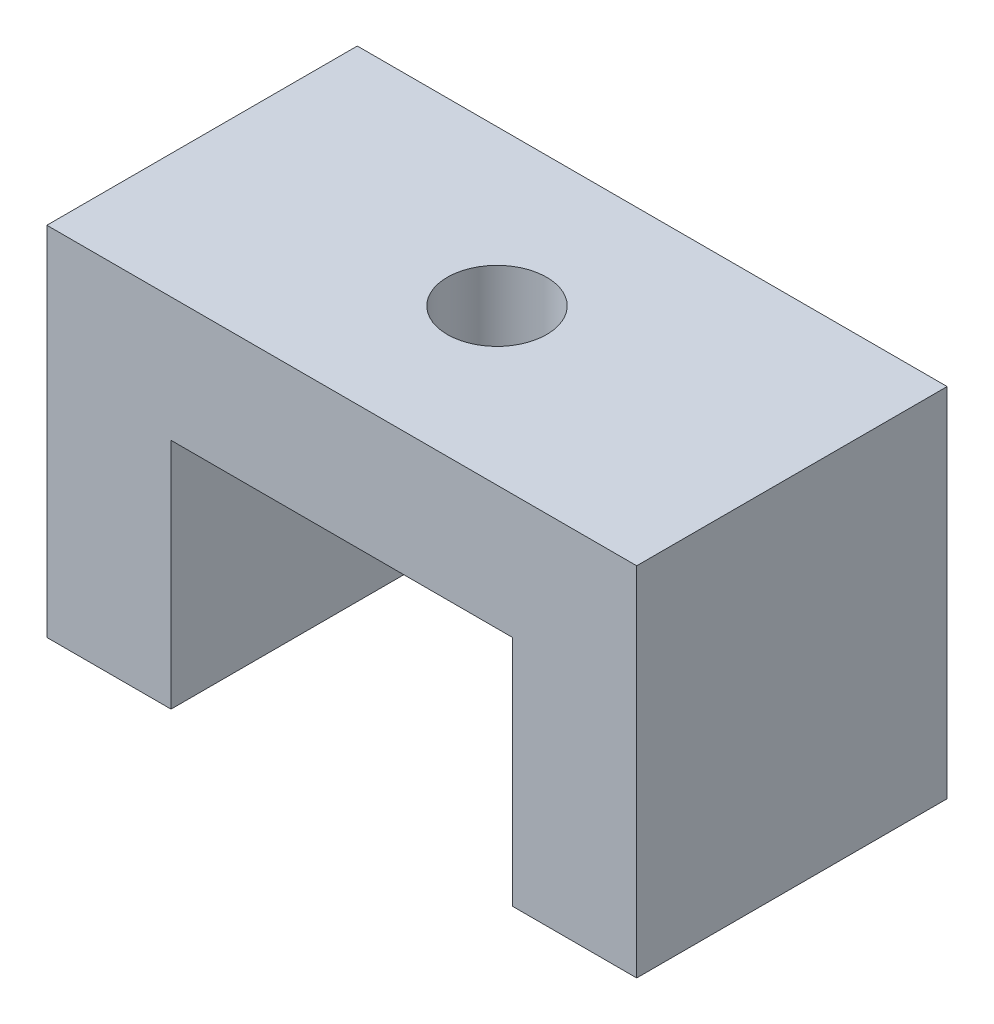
ISO-10303-21;
HEADER;
FILE_DESCRIPTION(('STEP AP214'),'2;1');
FILE_NAME('part.step','',(''),(''),'','','');
FILE_SCHEMA(('AUTOMOTIVE_DESIGN { 1 0 10303 214 1 1 1 1 }'));
ENDSEC;
DATA;
#1=APPLICATION_CONTEXT('core data for automotive mechanical design processes');
#2=APPLICATION_PROTOCOL_DEFINITION('international standard','automotive_design',2000,#1);
#3=PRODUCT_CONTEXT('',#1,'mechanical');
#4=PRODUCT('Part','Part','',(#3));
#5=PRODUCT_RELATED_PRODUCT_CATEGORY('part','',(#4));
#6=PRODUCT_DEFINITION_FORMATION('','',#4);
#7=PRODUCT_DEFINITION_CONTEXT('part definition',#1,'design');
#8=PRODUCT_DEFINITION('design','',#6,#7);
#9=PRODUCT_DEFINITION_SHAPE('','',#8);
#10=(LENGTH_UNIT() NAMED_UNIT(*) SI_UNIT(.MILLI.,.METRE.));
#11=(NAMED_UNIT(*) PLANE_ANGLE_UNIT() SI_UNIT($,.RADIAN.));
#12=(NAMED_UNIT(*) SI_UNIT($,.STERADIAN.) SOLID_ANGLE_UNIT());
#13=UNCERTAINTY_MEASURE_WITH_UNIT(LENGTH_MEASURE(1.E-05),#10,'distance_accuracy_value','');
#14=(GEOMETRIC_REPRESENTATION_CONTEXT(3) GLOBAL_UNCERTAINTY_ASSIGNED_CONTEXT((#13)) GLOBAL_UNIT_ASSIGNED_CONTEXT((#10,
#11,#12)) REPRESENTATION_CONTEXT('',''));
#15=CARTESIAN_POINT('',(0.,0.,0.));
#16=DIRECTION('',(0.,0.,1.));
#17=DIRECTION('',(1.,0.,0.));
#18=AXIS2_PLACEMENT_3D('',#15,#16,#17);
#19=CARTESIAN_POINT('',(0.,15.,0.));
#20=DIRECTION('',(0.,1.,0.));
#21=DIRECTION('',(0.,0.,1.));
#22=AXIS2_PLACEMENT_3D('',#19,#20,#21);
#23=PLANE('',#22);
#24=CARTESIAN_POINT('',(0.,15.,0.));
#25=DIRECTION('',(0.,1.,0.));
#26=DIRECTION('',(0.,0.,1.));
#27=AXIS2_PLACEMENT_3D('',#24,#25,#26);
#28=CIRCLE('',#27,3.2);
#29=CARTESIAN_POINT('',(0.,15.,3.2));
#30=VERTEX_POINT('',#29);
#31=EDGE_CURVE('E182',#30,#30,#28,.T.);
#32=ORIENTED_EDGE('',*,*,#31,.T.);
#33=EDGE_LOOP('',(#32));
#34=FACE_BOUND('',#33,.T.);
#35=DIRECTION('',(0.,0.,-1.));
#36=VECTOR('',#35,1.);
#37=CARTESIAN_POINT('',(-11.,15.,0.));
#38=LINE('',#37,#36);
#39=CARTESIAN_POINT('',(-11.,15.,10.));
#40=VERTEX_POINT('',#39);
#41=CARTESIAN_POINT('',(-11.,15.,-10.));
#42=VERTEX_POINT('',#41);
#43=EDGE_CURVE('E141',#40,#42,#38,.T.);
#44=ORIENTED_EDGE('',*,*,#43,.T.);
#45=DIRECTION('',(-1.,0.,0.));
#46=VECTOR('',#45,1.);
#47=CARTESIAN_POINT('',(19.,15.,-10.));
#48=LINE('',#47,#46);
#49=CARTESIAN_POINT('',(11.,15.,-10.));
#50=VERTEX_POINT('',#49);
#51=EDGE_CURVE('E57',#50,#42,#48,.T.);
#52=ORIENTED_EDGE('',*,*,#51,.F.);
#53=DIRECTION('',(0.,0.,-1.));
#54=VECTOR('',#53,1.);
#55=CARTESIAN_POINT('',(11.,15.,0.));
#56=LINE('',#55,#54);
#57=CARTESIAN_POINT('',(11.,15.,10.));
#58=VERTEX_POINT('',#57);
#59=EDGE_CURVE('E79',#58,#50,#56,.T.);
#60=ORIENTED_EDGE('',*,*,#59,.F.);
#61=DIRECTION('',(1.,0.,0.));
#62=VECTOR('',#61,1.);
#63=CARTESIAN_POINT('',(-19.,15.,10.));
#64=LINE('',#63,#62);
#65=EDGE_CURVE('E106',#40,#58,#64,.T.);
#66=ORIENTED_EDGE('',*,*,#65,.F.);
#67=EDGE_LOOP('',(#44,#52,#60,#66));
#68=FACE_BOUND('',#67,.T.);
#69=ADVANCED_FACE('F41',(#34,#68),#23,.F.);
#70=CARTESIAN_POINT('',(0.,15.,10.));
#71=DIRECTION('',(0.,0.,1.));
#72=DIRECTION('',(1.,0.,0.));
#73=AXIS2_PLACEMENT_3D('',#70,#71,#72);
#74=PLANE('',#73);
#75=DIRECTION('',(-1.,0.,0.));
#76=VECTOR('',#75,1.);
#77=CARTESIAN_POINT('',(0.,0.,10.));
#78=LINE('',#77,#76);
#79=CARTESIAN_POINT('',(19.,0.,10.));
#80=VERTEX_POINT('',#79);
#81=CARTESIAN_POINT('',(11.,0.,10.));
#82=VERTEX_POINT('',#81);
#83=EDGE_CURVE('E96',#80,#82,#78,.T.);
#84=ORIENTED_EDGE('',*,*,#83,.F.);
#85=DIRECTION('',(0.,-1.,0.));
#86=VECTOR('',#85,1.);
#87=CARTESIAN_POINT('',(19.,15.,10.));
#88=LINE('',#87,#86);
#89=CARTESIAN_POINT('',(19.,23.,10.));
#90=VERTEX_POINT('',#89);
#91=EDGE_CURVE('E11',#90,#80,#88,.T.);
#92=ORIENTED_EDGE('',*,*,#91,.F.);
#93=DIRECTION('',(1.,0.,0.));
#94=VECTOR('',#93,1.);
#95=CARTESIAN_POINT('',(-19.,23.,10.));
#96=LINE('',#95,#94);
#97=CARTESIAN_POINT('',(-19.,23.,10.));
#98=VERTEX_POINT('',#97);
#99=EDGE_CURVE('E167',#98,#90,#96,.T.);
#100=ORIENTED_EDGE('',*,*,#99,.F.);
#101=DIRECTION('',(0.,-1.,0.));
#102=VECTOR('',#101,1.);
#103=CARTESIAN_POINT('',(-19.,23.,10.));
#104=LINE('',#103,#102);
#105=CARTESIAN_POINT('',(-19.,0.,10.));
#106=VERTEX_POINT('',#105);
#107=EDGE_CURVE('E160',#98,#106,#104,.T.);
#108=ORIENTED_EDGE('',*,*,#107,.T.);
#109=DIRECTION('',(1.,0.,0.));
#110=VECTOR('',#109,1.);
#111=CARTESIAN_POINT('',(0.,0.,10.));
#112=LINE('',#111,#110);
#113=CARTESIAN_POINT('',(-11.,0.,10.));
#114=VERTEX_POINT('',#113);
#115=EDGE_CURVE('E150',#106,#114,#112,.T.);
#116=ORIENTED_EDGE('',*,*,#115,.T.);
#117=DIRECTION('',(0.,-1.,0.));
#118=VECTOR('',#117,1.);
#119=CARTESIAN_POINT('',(-11.,15.,10.));
#120=LINE('',#119,#118);
#121=EDGE_CURVE('E143',#40,#114,#120,.T.);
#122=ORIENTED_EDGE('',*,*,#121,.F.);
#123=ORIENTED_EDGE('',*,*,#65,.T.);
#124=DIRECTION('',(0.,-1.,0.));
#125=VECTOR('',#124,1.);
#126=CARTESIAN_POINT('',(11.,15.,10.));
#127=LINE('',#126,#125);
#128=EDGE_CURVE('E81',#58,#82,#127,.T.);
#129=ORIENTED_EDGE('',*,*,#128,.T.);
#130=EDGE_LOOP('',(#84,#92,#100,#108,#116,#122,#123,#129));
#131=FACE_BOUND('',#130,.T.);
#132=ADVANCED_FACE('F43',(#131),#74,.T.);
#133=CARTESIAN_POINT('',(19.,15.,0.));
#134=DIRECTION('',(-1.,0.,0.));
#135=DIRECTION('',(0.,0.,1.));
#136=AXIS2_PLACEMENT_3D('',#133,#134,#135);
#137=PLANE('',#136);
#138=DIRECTION('',(0.,0.,-1.));
#139=VECTOR('',#138,1.);
#140=CARTESIAN_POINT('',(19.,0.,0.));
#141=LINE('',#140,#139);
#142=CARTESIAN_POINT('',(19.,0.,-10.));
#143=VERTEX_POINT('',#142);
#144=EDGE_CURVE('E91',#80,#143,#141,.T.);
#145=ORIENTED_EDGE('',*,*,#144,.T.);
#146=DIRECTION('',(0.,-1.,0.));
#147=VECTOR('',#146,1.);
#148=CARTESIAN_POINT('',(19.,15.,-10.));
#149=LINE('',#148,#147);
#150=CARTESIAN_POINT('',(19.,23.,-10.));
#151=VERTEX_POINT('',#150);
#152=EDGE_CURVE('E50',#151,#143,#149,.T.);
#153=ORIENTED_EDGE('',*,*,#152,.F.);
#154=DIRECTION('',(0.,0.,-1.));
#155=VECTOR('',#154,1.);
#156=CARTESIAN_POINT('',(19.,23.,10.));
#157=LINE('',#156,#155);
#158=EDGE_CURVE('E165',#90,#151,#157,.T.);
#159=ORIENTED_EDGE('',*,*,#158,.F.);
#160=ORIENTED_EDGE('',*,*,#91,.T.);
#161=EDGE_LOOP('',(#145,#153,#159,#160));
#162=FACE_BOUND('',#161,.T.);
#163=ADVANCED_FACE('F163',(#162),#137,.F.);
#164=CARTESIAN_POINT('',(0.,15.,-10.));
#165=DIRECTION('',(0.,0.,-1.));
#166=DIRECTION('',(-1.,0.,0.));
#167=AXIS2_PLACEMENT_3D('',#164,#165,#166);
#168=PLANE('',#167);
#169=DIRECTION('',(1.,0.,0.));
#170=VECTOR('',#169,1.);
#171=CARTESIAN_POINT('',(0.,0.,-10.));
#172=LINE('',#171,#170);
#173=CARTESIAN_POINT('',(11.,0.,-10.));
#174=VERTEX_POINT('',#173);
#175=EDGE_CURVE('E84',#174,#143,#172,.T.);
#176=ORIENTED_EDGE('',*,*,#175,.F.);
#177=DIRECTION('',(0.,-1.,0.));
#178=VECTOR('',#177,1.);
#179=CARTESIAN_POINT('',(11.,15.,-10.));
#180=LINE('',#179,#178);
#181=EDGE_CURVE('E73',#50,#174,#180,.T.);
#182=ORIENTED_EDGE('',*,*,#181,.F.);
#183=ORIENTED_EDGE('',*,*,#51,.T.);
#184=DIRECTION('',(0.,-1.,0.));
#185=VECTOR('',#184,1.);
#186=CARTESIAN_POINT('',(-11.,15.,-10.));
#187=LINE('',#186,#185);
#188=CARTESIAN_POINT('',(-11.,0.,-10.));
#189=VERTEX_POINT('',#188);
#190=EDGE_CURVE('E146',#42,#189,#187,.T.);
#191=ORIENTED_EDGE('',*,*,#190,.T.);
#192=DIRECTION('',(-1.,0.,0.));
#193=VECTOR('',#192,1.);
#194=CARTESIAN_POINT('',(0.,0.,-10.));
#195=LINE('',#194,#193);
#196=CARTESIAN_POINT('',(-19.,0.,-10.));
#197=VERTEX_POINT('',#196);
#198=EDGE_CURVE('E177',#189,#197,#195,.T.);
#199=ORIENTED_EDGE('',*,*,#198,.T.);
#200=DIRECTION('',(0.,-1.,0.));
#201=VECTOR('',#200,1.);
#202=CARTESIAN_POINT('',(-19.,23.,-10.));
#203=LINE('',#202,#201);
#204=CARTESIAN_POINT('',(-19.,23.,-10.));
#205=VERTEX_POINT('',#204);
#206=EDGE_CURVE('E158',#205,#197,#203,.T.);
#207=ORIENTED_EDGE('',*,*,#206,.F.);
#208=DIRECTION('',(-1.,0.,0.));
#209=VECTOR('',#208,1.);
#210=CARTESIAN_POINT('',(19.,23.,-10.));
#211=LINE('',#210,#209);
#212=EDGE_CURVE('E113',#151,#205,#211,.T.);
#213=ORIENTED_EDGE('',*,*,#212,.F.);
#214=ORIENTED_EDGE('',*,*,#152,.T.);
#215=EDGE_LOOP('',(#176,#182,#183,#191,#199,#207,#213,#214));
#216=FACE_BOUND('',#215,.T.);
#217=ADVANCED_FACE('F85',(#216),#168,.T.);
#218=CARTESIAN_POINT('',(11.,15.,0.));
#219=DIRECTION('',(-1.,0.,0.));
#220=DIRECTION('',(0.,0.,1.));
#221=AXIS2_PLACEMENT_3D('',#218,#219,#220);
#222=PLANE('',#221);
#223=DIRECTION('',(0.,0.,-1.));
#224=VECTOR('',#223,1.);
#225=CARTESIAN_POINT('',(11.,0.,0.));
#226=LINE('',#225,#224);
#227=EDGE_CURVE('E78',#82,#174,#226,.T.);
#228=ORIENTED_EDGE('',*,*,#227,.F.);
#229=ORIENTED_EDGE('',*,*,#128,.F.);
#230=ORIENTED_EDGE('',*,*,#59,.T.);
#231=ORIENTED_EDGE('',*,*,#181,.T.);
#232=EDGE_LOOP('',(#228,#229,#230,#231));
#233=FACE_BOUND('',#232,.T.);
#234=ADVANCED_FACE('F75',(#233),#222,.T.);
#235=CARTESIAN_POINT('',(0.,0.,0.));
#236=DIRECTION('',(0.,1.,0.));
#237=DIRECTION('',(0.,0.,1.));
#238=AXIS2_PLACEMENT_3D('',#235,#236,#237);
#239=PLANE('',#238);
#240=CARTESIAN_POINT('',(15.,0.,0.));
#241=DIRECTION('',(0.,1.,0.));
#242=DIRECTION('',(0.,0.,1.));
#243=AXIS2_PLACEMENT_3D('',#240,#241,#242);
#244=CIRCLE('',#243,2.);
#245=CARTESIAN_POINT('',(15.,0.,2.));
#246=VERTEX_POINT('',#245);
#247=EDGE_CURVE('E190',#246,#246,#244,.T.);
#248=ORIENTED_EDGE('',*,*,#247,.T.);
#249=EDGE_LOOP('',(#248));
#250=FACE_BOUND('',#249,.T.);
#251=ORIENTED_EDGE('',*,*,#83,.T.);
#252=ORIENTED_EDGE('',*,*,#227,.T.);
#253=ORIENTED_EDGE('',*,*,#175,.T.);
#254=ORIENTED_EDGE('',*,*,#144,.F.);
#255=EDGE_LOOP('',(#251,#252,#253,#254));
#256=FACE_BOUND('',#255,.T.);
#257=ADVANCED_FACE('F94',(#250,#256),#239,.F.);
#258=CARTESIAN_POINT('',(-19.,23.,-10.));
#259=DIRECTION('',(1.,0.,0.));
#260=DIRECTION('',(0.,0.,-1.));
#261=AXIS2_PLACEMENT_3D('',#258,#259,#260);
#262=PLANE('',#261);
#263=ORIENTED_EDGE('',*,*,#206,.T.);
#264=DIRECTION('',(0.,0.,1.));
#265=VECTOR('',#264,1.);
#266=CARTESIAN_POINT('',(-19.,0.,0.));
#267=LINE('',#266,#265);
#268=EDGE_CURVE('E147',#197,#106,#267,.T.);
#269=ORIENTED_EDGE('',*,*,#268,.T.);
#270=ORIENTED_EDGE('',*,*,#107,.F.);
#271=DIRECTION('',(0.,0.,1.));
#272=VECTOR('',#271,1.);
#273=CARTESIAN_POINT('',(-19.,23.,-10.));
#274=LINE('',#273,#272);
#275=EDGE_CURVE('E153',#205,#98,#274,.T.);
#276=ORIENTED_EDGE('',*,*,#275,.F.);
#277=EDGE_LOOP('',(#263,#269,#270,#276));
#278=FACE_BOUND('',#277,.T.);
#279=ADVANCED_FACE('F227',(#278),#262,.F.);
#280=CARTESIAN_POINT('',(0.,23.,0.));
#281=DIRECTION('',(0.,1.,0.));
#282=DIRECTION('',(0.,0.,1.));
#283=AXIS2_PLACEMENT_3D('',#280,#281,#282);
#284=PLANE('',#283);
#285=CARTESIAN_POINT('',(0.,23.,0.));
#286=DIRECTION('',(0.,1.,0.));
#287=DIRECTION('',(0.,0.,1.));
#288=AXIS2_PLACEMENT_3D('',#285,#286,#287);
#289=CIRCLE('',#288,3.2);
#290=CARTESIAN_POINT('',(0.,23.,3.2));
#291=VERTEX_POINT('',#290);
#292=EDGE_CURVE('E186',#291,#291,#289,.T.);
#293=ORIENTED_EDGE('',*,*,#292,.F.);
#294=EDGE_LOOP('',(#293));
#295=FACE_BOUND('',#294,.T.);
#296=ORIENTED_EDGE('',*,*,#275,.T.);
#297=ORIENTED_EDGE('',*,*,#99,.T.);
#298=ORIENTED_EDGE('',*,*,#158,.T.);
#299=ORIENTED_EDGE('',*,*,#212,.T.);
#300=EDGE_LOOP('',(#296,#297,#298,#299));
#301=FACE_BOUND('',#300,.T.);
#302=ADVANCED_FACE('F168',(#295,#301),#284,.T.);
#303=CARTESIAN_POINT('',(-11.,15.,0.));
#304=DIRECTION('',(-1.,0.,0.));
#305=DIRECTION('',(0.,0.,1.));
#306=AXIS2_PLACEMENT_3D('',#303,#304,#305);
#307=PLANE('',#306);
#308=DIRECTION('',(0.,0.,-1.));
#309=VECTOR('',#308,1.);
#310=CARTESIAN_POINT('',(-11.,0.,0.));
#311=LINE('',#310,#309);
#312=EDGE_CURVE('E180',#114,#189,#311,.T.);
#313=ORIENTED_EDGE('',*,*,#312,.T.);
#314=ORIENTED_EDGE('',*,*,#190,.F.);
#315=ORIENTED_EDGE('',*,*,#43,.F.);
#316=ORIENTED_EDGE('',*,*,#121,.T.);
#317=EDGE_LOOP('',(#313,#314,#315,#316));
#318=FACE_BOUND('',#317,.T.);
#319=ADVANCED_FACE('F142',(#318),#307,.F.);
#320=CARTESIAN_POINT('',(0.,0.,0.));
#321=DIRECTION('',(0.,1.,0.));
#322=DIRECTION('',(0.,0.,1.));
#323=AXIS2_PLACEMENT_3D('',#320,#321,#322);
#324=PLANE('',#323);
#325=CARTESIAN_POINT('',(-15.,0.,0.));
#326=DIRECTION('',(0.,1.,0.));
#327=DIRECTION('',(0.,0.,1.));
#328=AXIS2_PLACEMENT_3D('',#325,#326,#327);
#329=CIRCLE('',#328,2.);
#330=CARTESIAN_POINT('',(-15.,0.,2.));
#331=VERTEX_POINT('',#330);
#332=EDGE_CURVE('E196',#331,#331,#329,.T.);
#333=ORIENTED_EDGE('',*,*,#332,.T.);
#334=EDGE_LOOP('',(#333));
#335=FACE_BOUND('',#334,.T.);
#336=ORIENTED_EDGE('',*,*,#115,.F.);
#337=ORIENTED_EDGE('',*,*,#268,.F.);
#338=ORIENTED_EDGE('',*,*,#198,.F.);
#339=ORIENTED_EDGE('',*,*,#312,.F.);
#340=EDGE_LOOP('',(#336,#337,#338,#339));
#341=FACE_BOUND('',#340,.T.);
#342=ADVANCED_FACE('F273',(#335,#341),#324,.F.);
#343=CARTESIAN_POINT('',(0.,13.,0.));
#344=DIRECTION('',(0.,1.,0.));
#345=DIRECTION('',(0.,0.,1.));
#346=AXIS2_PLACEMENT_3D('',#343,#344,#345);
#347=CYLINDRICAL_SURFACE('',#346,3.2);
#348=ORIENTED_EDGE('',*,*,#292,.T.);
#349=EDGE_LOOP('',(#348));
#350=FACE_BOUND('',#349,.T.);
#351=ORIENTED_EDGE('',*,*,#31,.F.);
#352=EDGE_LOOP('',(#351));
#353=FACE_BOUND('',#352,.T.);
#354=ADVANCED_FACE('F216',(#350,#353),#347,.F.);
#355=CARTESIAN_POINT('',(-15.,15.,0.));
#356=DIRECTION('',(0.,-1.,0.));
#357=DIRECTION('',(0.,0.,-1.));
#358=AXIS2_PLACEMENT_3D('',#355,#356,#357);
#359=CYLINDRICAL_SURFACE('',#358,2.);
#360=CARTESIAN_POINT('',(-15.,15.,0.));
#361=DIRECTION('',(0.,1.,0.));
#362=DIRECTION('',(0.,0.,1.));
#363=AXIS2_PLACEMENT_3D('',#360,#361,#362);
#364=CIRCLE('',#363,2.);
#365=CARTESIAN_POINT('',(-15.,15.,2.));
#366=VERTEX_POINT('',#365);
#367=EDGE_CURVE('E189',#366,#366,#364,.T.);
#368=ORIENTED_EDGE('',*,*,#367,.T.);
#369=EDGE_LOOP('',(#368));
#370=FACE_BOUND('',#369,.T.);
#371=ORIENTED_EDGE('',*,*,#332,.F.);
#372=EDGE_LOOP('',(#371));
#373=FACE_BOUND('',#372,.T.);
#374=ADVANCED_FACE('F202',(#370,#373),#359,.F.);
#375=CARTESIAN_POINT('',(0.,15.,0.));
#376=DIRECTION('',(0.,1.,0.));
#377=DIRECTION('',(0.,0.,1.));
#378=AXIS2_PLACEMENT_3D('',#375,#376,#377);
#379=PLANE('',#378);
#380=ORIENTED_EDGE('',*,*,#367,.F.);
#381=EDGE_LOOP('',(#380));
#382=FACE_BOUND('',#381,.T.);
#383=ADVANCED_FACE('F205',(#382),#379,.F.);
#384=CARTESIAN_POINT('',(15.,15.,0.));
#385=DIRECTION('',(0.,-1.,0.));
#386=DIRECTION('',(0.,0.,-1.));
#387=AXIS2_PLACEMENT_3D('',#384,#385,#386);
#388=CYLINDRICAL_SURFACE('',#387,2.);
#389=CARTESIAN_POINT('',(15.,15.,0.));
#390=DIRECTION('',(0.,1.,0.));
#391=DIRECTION('',(0.,0.,1.));
#392=AXIS2_PLACEMENT_3D('',#389,#390,#391);
#393=CIRCLE('',#392,2.);
#394=CARTESIAN_POINT('',(15.,15.,2.));
#395=VERTEX_POINT('',#394);
#396=EDGE_CURVE('E193',#395,#395,#393,.T.);
#397=ORIENTED_EDGE('',*,*,#396,.T.);
#398=EDGE_LOOP('',(#397));
#399=FACE_BOUND('',#398,.T.);
#400=ORIENTED_EDGE('',*,*,#247,.F.);
#401=EDGE_LOOP('',(#400));
#402=FACE_BOUND('',#401,.T.);
#403=ADVANCED_FACE('F207',(#399,#402),#388,.F.);
#404=CARTESIAN_POINT('',(0.,15.,0.));
#405=DIRECTION('',(0.,1.,0.));
#406=DIRECTION('',(0.,0.,1.));
#407=AXIS2_PLACEMENT_3D('',#404,#405,#406);
#408=PLANE('',#407);
#409=ORIENTED_EDGE('',*,*,#396,.F.);
#410=EDGE_LOOP('',(#409));
#411=FACE_BOUND('',#410,.T.);
#412=ADVANCED_FACE('F213',(#411),#408,.F.);
#413=CLOSED_SHELL('',(#69,#132,#163,#217,#234,#257,#279,#302,#319,#342,#354,#374,#383,#403,#412));
#414=MANIFOLD_SOLID_BREP('B2',#413);
#415=ADVANCED_BREP_SHAPE_REPRESENTATION('',(#18,#414),#14);
#416=SHAPE_DEFINITION_REPRESENTATION(#9,#415);
ENDSEC;
END-ISO-10303-21;
